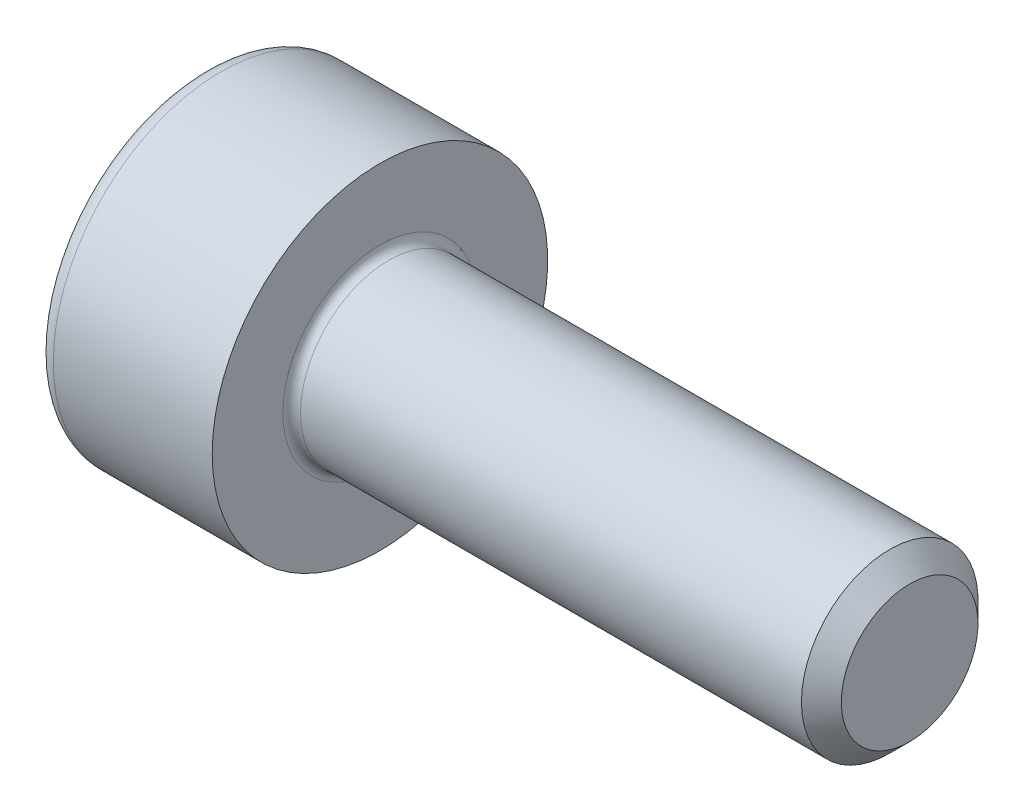
ISO-10303-21;
HEADER;
FILE_DESCRIPTION(('STEP AP214'),'2;1');
FILE_NAME('part.step','',(''),(''),'','','');
FILE_SCHEMA(('AUTOMOTIVE_DESIGN { 1 0 10303 214 1 1 1 1 }'));
ENDSEC;
DATA;
#1=APPLICATION_CONTEXT('core data for automotive mechanical design processes');
#2=APPLICATION_PROTOCOL_DEFINITION('international standard','automotive_design',2000,#1);
#3=PRODUCT_CONTEXT('',#1,'mechanical');
#4=PRODUCT('Part','Part','',(#3));
#5=PRODUCT_RELATED_PRODUCT_CATEGORY('part','',(#4));
#6=PRODUCT_DEFINITION_FORMATION('','',#4);
#7=PRODUCT_DEFINITION_CONTEXT('part definition',#1,'design');
#8=PRODUCT_DEFINITION('design','',#6,#7);
#9=PRODUCT_DEFINITION_SHAPE('','',#8);
#10=(LENGTH_UNIT() NAMED_UNIT(*) SI_UNIT(.MILLI.,.METRE.));
#11=(NAMED_UNIT(*) PLANE_ANGLE_UNIT() SI_UNIT($,.RADIAN.));
#12=(NAMED_UNIT(*) SI_UNIT($,.STERADIAN.) SOLID_ANGLE_UNIT());
#13=UNCERTAINTY_MEASURE_WITH_UNIT(LENGTH_MEASURE(1.E-05),#10,'distance_accuracy_value','');
#14=(GEOMETRIC_REPRESENTATION_CONTEXT(3) GLOBAL_UNCERTAINTY_ASSIGNED_CONTEXT((#13)) GLOBAL_UNIT_ASSIGNED_CONTEXT((#10,
#11,#12)) REPRESENTATION_CONTEXT('',''));
#15=CARTESIAN_POINT('',(0.,0.,0.));
#16=DIRECTION('',(0.,0.,1.));
#17=DIRECTION('',(1.,0.,0.));
#18=AXIS2_PLACEMENT_3D('',#15,#16,#17);
#19=CARTESIAN_POINT('',(0.999999999976353,0.,0.));
#20=DIRECTION('',(-1.,0.,0.));
#21=DIRECTION('',(0.,0.,1.));
#22=AXIS2_PLACEMENT_3D('',#19,#20,#21);
#23=CONICAL_SURFACE('',#22,0.760000000013861,1.04719755119142);
#24=CARTESIAN_POINT('',(1.43878620457372,0.,0.));
#25=VERTEX_POINT('',#24);
#26=VERTEX_LOOP('',#25);
#27=FACE_BOUND('',#26,.T.);
#28=CARTESIAN_POINT('',(0.999999999976353,0.,0.));
#29=DIRECTION('',(-1.,0.,0.));
#30=DIRECTION('',(0.,0.,1.));
#31=AXIS2_PLACEMENT_3D('',#28,#29,#30);
#32=CIRCLE('',#31,0.760000000013861);
#33=CARTESIAN_POINT('',(0.999999999988177,-0.658179306882178,0.380000000003467));
#34=VERTEX_POINT('',#33);
#35=CARTESIAN_POINT('',(0.999999999988177,0.,0.760000000006931));
#36=VERTEX_POINT('',#35);
#37=EDGE_CURVE('E101',#34,#36,#32,.T.);
#38=ORIENTED_EDGE('',*,*,#37,.T.);
#39=CARTESIAN_POINT('',(0.999999999976353,0.,0.));
#40=DIRECTION('',(-1.,0.,0.));
#41=DIRECTION('',(0.,0.,1.));
#42=AXIS2_PLACEMENT_3D('',#39,#40,#41);
#43=CIRCLE('',#42,0.760000000013861);
#44=CARTESIAN_POINT('',(0.999999999988177,0.658179306882173,0.380000000003464));
#45=VERTEX_POINT('',#44);
#46=EDGE_CURVE('E104',#36,#45,#43,.T.);
#47=ORIENTED_EDGE('',*,*,#46,.T.);
#48=CARTESIAN_POINT('',(0.999999999976353,0.,0.));
#49=DIRECTION('',(-1.,0.,0.));
#50=DIRECTION('',(0.,0.,1.));
#51=AXIS2_PLACEMENT_3D('',#48,#49,#50);
#52=CIRCLE('',#51,0.760000000013861);
#53=CARTESIAN_POINT('',(0.999999999988177,0.658179306882173,-0.380000000003465));
#54=VERTEX_POINT('',#53);
#55=EDGE_CURVE('E106',#45,#54,#52,.T.);
#56=ORIENTED_EDGE('',*,*,#55,.T.);
#57=CARTESIAN_POINT('',(0.999999999976353,0.,0.));
#58=DIRECTION('',(-1.,0.,0.));
#59=DIRECTION('',(0.,0.,1.));
#60=AXIS2_PLACEMENT_3D('',#57,#58,#59);
#61=CIRCLE('',#60,0.760000000013861);
#62=CARTESIAN_POINT('',(0.999999999988177,2.50381150740489E-13,-0.76000000000693));
#63=VERTEX_POINT('',#62);
#64=EDGE_CURVE('E120',#54,#63,#61,.T.);
#65=ORIENTED_EDGE('',*,*,#64,.T.);
#66=CARTESIAN_POINT('',(0.999999999976353,0.,0.));
#67=DIRECTION('',(-1.,0.,0.));
#68=DIRECTION('',(0.,0.,1.));
#69=AXIS2_PLACEMENT_3D('',#66,#67,#68);
#70=CIRCLE('',#69,0.760000000013861);
#71=CARTESIAN_POINT('',(0.999999999988177,-0.658179306882177,-0.380000000003467));
#72=VERTEX_POINT('',#71);
#73=EDGE_CURVE('E121',#63,#72,#70,.T.);
#74=ORIENTED_EDGE('',*,*,#73,.T.);
#75=CARTESIAN_POINT('',(0.999999999976353,0.,0.));
#76=DIRECTION('',(-1.,0.,0.));
#77=DIRECTION('',(0.,0.,1.));
#78=AXIS2_PLACEMENT_3D('',#75,#76,#77);
#79=CIRCLE('',#78,0.760000000013861);
#80=EDGE_CURVE('E229',#72,#34,#79,.T.);
#81=ORIENTED_EDGE('',*,*,#80,.T.);
#82=EDGE_LOOP('',(#38,#47,#56,#65,#74,#81));
#83=FACE_BOUND('',#82,.T.);
#84=ADVANCED_FACE('F16',(#27,#83),#23,.F.);
#85=CARTESIAN_POINT('',(1.,0.877572409168227,0.));
#86=DIRECTION('',(1.,0.,0.));
#87=DIRECTION('',(0.,0.,-1.));
#88=AXIS2_PLACEMENT_3D('',#85,#86,#87);
#89=PLANE('',#88);
#90=DIRECTION('',(0.,0.5,-0.866025403784438));
#91=VECTOR('',#90,1.);
#92=CARTESIAN_POINT('',(1.,0.877572409168227,0.));
#93=LINE('',#92,#91);
#94=CARTESIAN_POINT('',(1.,0.43878620458411,0.760000000000001));
#95=VERTEX_POINT('',#94);
#96=EDGE_CURVE('E124',#45,#95,#93,.F.);
#97=ORIENTED_EDGE('',*,*,#96,.F.);
#98=ORIENTED_EDGE('',*,*,#46,.F.);
#99=DIRECTION('',(0.,-1.,0.));
#100=VECTOR('',#99,1.);
#101=CARTESIAN_POINT('',(1.,-0.438786204584121,0.760000000000002));
#102=LINE('',#101,#100);
#103=EDGE_CURVE('E126',#36,#95,#102,.F.);
#104=ORIENTED_EDGE('',*,*,#103,.T.);
#105=EDGE_LOOP('',(#97,#98,#104));
#106=FACE_BOUND('',#105,.T.);
#107=ADVANCED_FACE('F125',(#106),#89,.F.);
#108=CARTESIAN_POINT('',(1.,0.877572409168227,0.));
#109=DIRECTION('',(1.,0.,0.));
#110=DIRECTION('',(0.,0.,-1.));
#111=AXIS2_PLACEMENT_3D('',#108,#109,#110);
#112=PLANE('',#111);
#113=DIRECTION('',(0.,-1.,0.));
#114=VECTOR('',#113,1.);
#115=CARTESIAN_POINT('',(1.,-0.438786204584121,0.760000000000002));
#116=LINE('',#115,#114);
#117=CARTESIAN_POINT('',(1.,-0.438786204584121,0.760000000000002));
#118=VERTEX_POINT('',#117);
#119=EDGE_CURVE('E129',#118,#36,#116,.F.);
#120=ORIENTED_EDGE('',*,*,#119,.T.);
#121=ORIENTED_EDGE('',*,*,#37,.F.);
#122=DIRECTION('',(0.,0.500000000000001,0.866025403784438));
#123=VECTOR('',#122,1.);
#124=CARTESIAN_POINT('',(1.,-0.438786204584121,0.760000000000002));
#125=LINE('',#124,#123);
#126=EDGE_CURVE('E182',#118,#34,#125,.F.);
#127=ORIENTED_EDGE('',*,*,#126,.F.);
#128=EDGE_LOOP('',(#120,#121,#127));
#129=FACE_BOUND('',#128,.T.);
#130=ADVANCED_FACE('F514',(#129),#112,.F.);
#131=CARTESIAN_POINT('',(1.,0.877572409168227,0.));
#132=DIRECTION('',(1.,0.,0.));
#133=DIRECTION('',(0.,0.,-1.));
#134=AXIS2_PLACEMENT_3D('',#131,#132,#133);
#135=PLANE('',#134);
#136=DIRECTION('',(0.,0.500000000000001,0.866025403784438));
#137=VECTOR('',#136,1.);
#138=CARTESIAN_POINT('',(1.,-0.438786204584121,0.760000000000002));
#139=LINE('',#138,#137);
#140=CARTESIAN_POINT('',(1.,-0.877572409168238,0.));
#141=VERTEX_POINT('',#140);
#142=EDGE_CURVE('E178',#34,#141,#139,.F.);
#143=ORIENTED_EDGE('',*,*,#142,.F.);
#144=ORIENTED_EDGE('',*,*,#80,.F.);
#145=DIRECTION('',(0.,-0.5,0.866025403784439));
#146=VECTOR('',#145,1.);
#147=CARTESIAN_POINT('',(1.,-0.877572409168238,0.));
#148=LINE('',#147,#146);
#149=EDGE_CURVE('E165',#141,#72,#148,.F.);
#150=ORIENTED_EDGE('',*,*,#149,.F.);
#151=EDGE_LOOP('',(#143,#144,#150));
#152=FACE_BOUND('',#151,.T.);
#153=ADVANCED_FACE('F505',(#152),#135,.F.);
#154=CARTESIAN_POINT('',(1.,0.877572409168227,0.));
#155=DIRECTION('',(1.,0.,0.));
#156=DIRECTION('',(0.,0.,-1.));
#157=AXIS2_PLACEMENT_3D('',#154,#155,#156);
#158=PLANE('',#157);
#159=DIRECTION('',(0.,-0.5,0.866025403784439));
#160=VECTOR('',#159,1.);
#161=CARTESIAN_POINT('',(1.,-0.877572409168238,0.));
#162=LINE('',#161,#160);
#163=CARTESIAN_POINT('',(1.,-0.438786204584122,-0.759999999999999));
#164=VERTEX_POINT('',#163);
#165=EDGE_CURVE('E162',#72,#164,#162,.F.);
#166=ORIENTED_EDGE('',*,*,#165,.F.);
#167=ORIENTED_EDGE('',*,*,#73,.F.);
#168=DIRECTION('',(0.,1.,0.));
#169=VECTOR('',#168,1.);
#170=CARTESIAN_POINT('',(1.,0.438786204584109,-0.76));
#171=LINE('',#170,#169);
#172=EDGE_CURVE('E156',#63,#164,#171,.F.);
#173=ORIENTED_EDGE('',*,*,#172,.T.);
#174=EDGE_LOOP('',(#166,#167,#173));
#175=FACE_BOUND('',#174,.T.);
#176=ADVANCED_FACE('F497',(#175),#158,.F.);
#177=CARTESIAN_POINT('',(1.,0.877572409168227,0.));
#178=DIRECTION('',(1.,0.,0.));
#179=DIRECTION('',(0.,0.,-1.));
#180=AXIS2_PLACEMENT_3D('',#177,#178,#179);
#181=PLANE('',#180);
#182=DIRECTION('',(0.,0.500000000000001,0.866025403784438));
#183=VECTOR('',#182,1.);
#184=CARTESIAN_POINT('',(1.,0.877572409168227,0.));
#185=LINE('',#184,#183);
#186=CARTESIAN_POINT('',(1.,0.877572409168227,0.));
#187=VERTEX_POINT('',#186);
#188=EDGE_CURVE('E118',#187,#54,#185,.F.);
#189=ORIENTED_EDGE('',*,*,#188,.T.);
#190=ORIENTED_EDGE('',*,*,#55,.F.);
#191=DIRECTION('',(0.,0.5,-0.866025403784438));
#192=VECTOR('',#191,1.);
#193=CARTESIAN_POINT('',(1.,0.877572409168227,0.));
#194=LINE('',#193,#192);
#195=EDGE_CURVE('E115',#187,#45,#194,.F.);
#196=ORIENTED_EDGE('',*,*,#195,.F.);
#197=EDGE_LOOP('',(#189,#190,#196));
#198=FACE_BOUND('',#197,.T.);
#199=ADVANCED_FACE('F113',(#198),#181,.F.);
#200=CARTESIAN_POINT('',(1.,0.877572409168227,0.));
#201=DIRECTION('',(1.,0.,0.));
#202=DIRECTION('',(0.,0.,-1.));
#203=AXIS2_PLACEMENT_3D('',#200,#201,#202);
#204=PLANE('',#203);
#205=DIRECTION('',(0.,1.,0.));
#206=VECTOR('',#205,1.);
#207=CARTESIAN_POINT('',(1.,0.438786204584109,-0.76));
#208=LINE('',#207,#206);
#209=CARTESIAN_POINT('',(1.,0.438786204584109,-0.76));
#210=VERTEX_POINT('',#209);
#211=EDGE_CURVE('E159',#210,#63,#208,.F.);
#212=ORIENTED_EDGE('',*,*,#211,.T.);
#213=ORIENTED_EDGE('',*,*,#64,.F.);
#214=DIRECTION('',(0.,0.500000000000001,0.866025403784438));
#215=VECTOR('',#214,1.);
#216=CARTESIAN_POINT('',(1.,0.877572409168227,0.));
#217=LINE('',#216,#215);
#218=EDGE_CURVE('E316',#54,#210,#217,.F.);
#219=ORIENTED_EDGE('',*,*,#218,.T.);
#220=EDGE_LOOP('',(#212,#213,#219));
#221=FACE_BOUND('',#220,.T.);
#222=ADVANCED_FACE('F481',(#221),#204,.F.);
#223=CARTESIAN_POINT('',(1.,0.877572409168227,0.));
#224=DIRECTION('',(0.,-0.866025403784438,-0.5));
#225=DIRECTION('',(0.,0.5,-0.866025403784438));
#226=AXIS2_PLACEMENT_3D('',#223,#224,#225);
#227=PLANE('',#226);
#228=ORIENTED_EDGE('',*,*,#96,.T.);
#229=DIRECTION('',(1.,0.,0.));
#230=VECTOR('',#229,1.);
#231=CARTESIAN_POINT('',(1.,0.43878620458411,0.76));
#232=LINE('',#231,#230);
#233=CARTESIAN_POINT('',(0.,0.43878620458411,0.76));
#234=VERTEX_POINT('',#233);
#235=EDGE_CURVE('E202',#95,#234,#232,.F.);
#236=ORIENTED_EDGE('',*,*,#235,.T.);
#237=DIRECTION('',(0.,-0.5,0.866025403784438));
#238=VECTOR('',#237,1.);
#239=CARTESIAN_POINT('',(0.,0.877572409168227,0.));
#240=LINE('',#239,#238);
#241=CARTESIAN_POINT('',(0.,0.877572409168227,0.));
#242=VERTEX_POINT('',#241);
#243=EDGE_CURVE('E142',#242,#234,#240,.T.);
#244=ORIENTED_EDGE('',*,*,#243,.F.);
#245=DIRECTION('',(1.,0.,0.));
#246=VECTOR('',#245,1.);
#247=CARTESIAN_POINT('',(1.,0.877572409168227,0.));
#248=LINE('',#247,#246);
#249=EDGE_CURVE('E133',#242,#187,#248,.T.);
#250=ORIENTED_EDGE('',*,*,#249,.T.);
#251=ORIENTED_EDGE('',*,*,#195,.T.);
#252=EDGE_LOOP('',(#228,#236,#244,#250,#251));
#253=FACE_BOUND('',#252,.T.);
#254=ADVANCED_FACE('F131',(#253),#227,.T.);
#255=CARTESIAN_POINT('',(1.,-0.438786204584121,0.760000000000002));
#256=DIRECTION('',(0.,0.,1.));
#257=DIRECTION('',(0.,-1.,0.));
#258=AXIS2_PLACEMENT_3D('',#255,#256,#257);
#259=PLANE('',#258);
#260=ORIENTED_EDGE('',*,*,#235,.F.);
#261=ORIENTED_EDGE('',*,*,#103,.F.);
#262=ORIENTED_EDGE('',*,*,#119,.F.);
#263=DIRECTION('',(1.,0.,0.));
#264=VECTOR('',#263,1.);
#265=CARTESIAN_POINT('',(1.,-0.438786204584121,0.760000000000002));
#266=LINE('',#265,#264);
#267=CARTESIAN_POINT('',(0.,-0.438786204584121,0.760000000000001));
#268=VERTEX_POINT('',#267);
#269=EDGE_CURVE('E197',#268,#118,#266,.T.);
#270=ORIENTED_EDGE('',*,*,#269,.F.);
#271=DIRECTION('',(0.,1.,0.));
#272=VECTOR('',#271,1.);
#273=CARTESIAN_POINT('',(0.,0.,0.76));
#274=LINE('',#273,#272);
#275=EDGE_CURVE('E145',#234,#268,#274,.F.);
#276=ORIENTED_EDGE('',*,*,#275,.F.);
#277=EDGE_LOOP('',(#260,#261,#262,#270,#276));
#278=FACE_BOUND('',#277,.T.);
#279=ADVANCED_FACE('F464',(#278),#259,.F.);
#280=CARTESIAN_POINT('',(1.,-0.438786204584121,0.760000000000002));
#281=DIRECTION('',(0.,0.866025403784438,-0.500000000000001));
#282=DIRECTION('',(0.,0.500000000000001,0.866025403784438));
#283=AXIS2_PLACEMENT_3D('',#280,#281,#282);
#284=PLANE('',#283);
#285=ORIENTED_EDGE('',*,*,#142,.T.);
#286=DIRECTION('',(1.,0.,0.));
#287=VECTOR('',#286,1.);
#288=CARTESIAN_POINT('',(1.,-0.877572409168238,0.));
#289=LINE('',#288,#287);
#290=CARTESIAN_POINT('',(0.,-0.877572409168238,0.));
#291=VERTEX_POINT('',#290);
#292=EDGE_CURVE('E173',#291,#141,#289,.T.);
#293=ORIENTED_EDGE('',*,*,#292,.F.);
#294=DIRECTION('',(0.,-0.500000000000001,-0.866025403784438));
#295=VECTOR('',#294,1.);
#296=CARTESIAN_POINT('',(0.,-0.438786204584121,0.760000000000002));
#297=LINE('',#296,#295);
#298=EDGE_CURVE('E188',#268,#291,#297,.T.);
#299=ORIENTED_EDGE('',*,*,#298,.F.);
#300=ORIENTED_EDGE('',*,*,#269,.T.);
#301=ORIENTED_EDGE('',*,*,#126,.T.);
#302=EDGE_LOOP('',(#285,#293,#299,#300,#301));
#303=FACE_BOUND('',#302,.T.);
#304=ADVANCED_FACE('F455',(#303),#284,.T.);
#305=CARTESIAN_POINT('',(1.,-0.877572409168238,0.));
#306=DIRECTION('',(0.,0.866025403784439,0.5));
#307=DIRECTION('',(0.,-0.5,0.866025403784439));
#308=AXIS2_PLACEMENT_3D('',#305,#306,#307);
#309=PLANE('',#308);
#310=ORIENTED_EDGE('',*,*,#165,.T.);
#311=DIRECTION('',(1.,0.,0.));
#312=VECTOR('',#311,1.);
#313=CARTESIAN_POINT('',(1.,-0.438786204584122,-0.759999999999999));
#314=LINE('',#313,#312);
#315=CARTESIAN_POINT('',(0.,-0.438786204584122,-0.759999999999999));
#316=VERTEX_POINT('',#315);
#317=EDGE_CURVE('E158',#164,#316,#314,.F.);
#318=ORIENTED_EDGE('',*,*,#317,.T.);
#319=DIRECTION('',(0.,0.5,-0.866025403784439));
#320=VECTOR('',#319,1.);
#321=CARTESIAN_POINT('',(0.,-0.877572409168238,0.));
#322=LINE('',#321,#320);
#323=EDGE_CURVE('E185',#291,#316,#322,.T.);
#324=ORIENTED_EDGE('',*,*,#323,.F.);
#325=ORIENTED_EDGE('',*,*,#292,.T.);
#326=ORIENTED_EDGE('',*,*,#149,.T.);
#327=EDGE_LOOP('',(#310,#318,#324,#325,#326));
#328=FACE_BOUND('',#327,.T.);
#329=ADVANCED_FACE('F447',(#328),#309,.T.);
#330=CARTESIAN_POINT('',(1.,0.438786204584109,-0.76));
#331=DIRECTION('',(0.,0.,-1.));
#332=DIRECTION('',(0.,1.,0.));
#333=AXIS2_PLACEMENT_3D('',#330,#331,#332);
#334=PLANE('',#333);
#335=ORIENTED_EDGE('',*,*,#317,.F.);
#336=ORIENTED_EDGE('',*,*,#172,.F.);
#337=ORIENTED_EDGE('',*,*,#211,.F.);
#338=DIRECTION('',(1.,0.,0.));
#339=VECTOR('',#338,1.);
#340=CARTESIAN_POINT('',(1.,0.438786204584109,-0.76));
#341=LINE('',#340,#339);
#342=CARTESIAN_POINT('',(0.,0.43878620458411,-0.76));
#343=VERTEX_POINT('',#342);
#344=EDGE_CURVE('E146',#210,#343,#341,.F.);
#345=ORIENTED_EDGE('',*,*,#344,.T.);
#346=DIRECTION('',(0.,1.,0.));
#347=VECTOR('',#346,1.);
#348=CARTESIAN_POINT('',(0.,0.,-0.759999999999999));
#349=LINE('',#348,#347);
#350=EDGE_CURVE('E153',#316,#343,#349,.T.);
#351=ORIENTED_EDGE('',*,*,#350,.F.);
#352=EDGE_LOOP('',(#335,#336,#337,#345,#351));
#353=FACE_BOUND('',#352,.T.);
#354=ADVANCED_FACE('F334',(#353),#334,.F.);
#355=CARTESIAN_POINT('',(1.,0.877572409168227,0.));
#356=DIRECTION('',(0.,0.866025403784438,-0.500000000000001));
#357=DIRECTION('',(0.,0.500000000000001,0.866025403784438));
#358=AXIS2_PLACEMENT_3D('',#355,#356,#357);
#359=PLANE('',#358);
#360=ORIENTED_EDGE('',*,*,#344,.F.);
#361=ORIENTED_EDGE('',*,*,#218,.F.);
#362=ORIENTED_EDGE('',*,*,#188,.F.);
#363=ORIENTED_EDGE('',*,*,#249,.F.);
#364=DIRECTION('',(0.,0.500000000000001,0.866025403784438));
#365=VECTOR('',#364,1.);
#366=CARTESIAN_POINT('',(0.,0.438786204584109,-0.76));
#367=LINE('',#366,#365);
#368=EDGE_CURVE('E149',#343,#242,#367,.T.);
#369=ORIENTED_EDGE('',*,*,#368,.F.);
#370=EDGE_LOOP('',(#360,#361,#362,#363,#369));
#371=FACE_BOUND('',#370,.T.);
#372=ADVANCED_FACE('F339',(#371),#359,.F.);
#373=CARTESIAN_POINT('',(0.,0.,0.));
#374=DIRECTION('',(-1.,0.,0.));
#375=DIRECTION('',(0.,0.,1.));
#376=AXIS2_PLACEMENT_3D('',#373,#374,#375);
#377=PLANE('',#376);
#378=CARTESIAN_POINT('',(0.,0.,0.));
#379=DIRECTION('',(1.,0.,0.));
#380=DIRECTION('',(0.,0.,-1.));
#381=AXIS2_PLACEMENT_3D('',#378,#379,#380);
#382=CIRCLE('',#381,1.7);
#383=CARTESIAN_POINT('',(0.,0.,-1.7));
#384=VERTEX_POINT('',#383);
#385=CARTESIAN_POINT('',(0.,0.,1.7));
#386=VERTEX_POINT('',#385);
#387=EDGE_CURVE('E152',#384,#386,#382,.T.);
#388=ORIENTED_EDGE('',*,*,#387,.F.);
#389=CARTESIAN_POINT('',(0.,0.,0.));
#390=DIRECTION('',(1.,0.,0.));
#391=DIRECTION('',(0.,0.,1.));
#392=AXIS2_PLACEMENT_3D('',#389,#390,#391);
#393=CIRCLE('',#392,1.7);
#394=EDGE_CURVE('E354',#386,#384,#393,.T.);
#395=ORIENTED_EDGE('',*,*,#394,.F.);
#396=EDGE_LOOP('',(#388,#395));
#397=FACE_BOUND('',#396,.T.);
#398=ORIENTED_EDGE('',*,*,#350,.T.);
#399=ORIENTED_EDGE('',*,*,#368,.T.);
#400=ORIENTED_EDGE('',*,*,#243,.T.);
#401=ORIENTED_EDGE('',*,*,#275,.T.);
#402=ORIENTED_EDGE('',*,*,#298,.T.);
#403=ORIENTED_EDGE('',*,*,#323,.T.);
#404=EDGE_LOOP('',(#398,#399,#400,#401,#402,#403));
#405=FACE_BOUND('',#404,.T.);
#406=ADVANCED_FACE('F298',(#397,#405),#377,.T.);
#407=CARTESIAN_POINT('',(0.199999999999999,0.,0.));
#408=DIRECTION('',(-1.,0.,0.));
#409=DIRECTION('',(0.,0.,1.));
#410=AXIS2_PLACEMENT_3D('',#407,#408,#409);
#411=TOROIDAL_SURFACE('',#410,1.7,0.2);
#412=CARTESIAN_POINT('',(0.199999999999999,0.,0.));
#413=DIRECTION('',(-1.,0.,0.));
#414=DIRECTION('',(0.,0.,1.));
#415=AXIS2_PLACEMENT_3D('',#412,#413,#414);
#416=CIRCLE('',#415,1.9);
#417=CARTESIAN_POINT('',(0.199999999999999,0.,1.9));
#418=VERTEX_POINT('',#417);
#419=EDGE_CURVE('E226',#418,#418,#416,.F.);
#420=ORIENTED_EDGE('',*,*,#419,.F.);
#421=EDGE_LOOP('',(#420));
#422=FACE_BOUND('',#421,.T.);
#423=ORIENTED_EDGE('',*,*,#394,.T.);
#424=ORIENTED_EDGE('',*,*,#387,.T.);
#425=EDGE_LOOP('',(#423,#424));
#426=FACE_BOUND('',#425,.T.);
#427=ADVANCED_FACE('F293',(#422,#426),#411,.T.);
#428=CARTESIAN_POINT('',(-31.75,0.,0.));
#429=DIRECTION('',(-1.,0.,0.));
#430=DIRECTION('',(0.,0.,1.));
#431=AXIS2_PLACEMENT_3D('',#428,#429,#430);
#432=CYLINDRICAL_SURFACE('',#431,1.9);
#433=CARTESIAN_POINT('',(2.,0.,0.));
#434=DIRECTION('',(-1.,0.,0.));
#435=DIRECTION('',(0.,0.,1.));
#436=AXIS2_PLACEMENT_3D('',#433,#434,#435);
#437=CIRCLE('',#436,1.9);
#438=CARTESIAN_POINT('',(2.,0.,1.9));
#439=VERTEX_POINT('',#438);
#440=EDGE_CURVE('E224',#439,#439,#437,.F.);
#441=ORIENTED_EDGE('',*,*,#440,.F.);
#442=EDGE_LOOP('',(#441));
#443=FACE_BOUND('',#442,.T.);
#444=ORIENTED_EDGE('',*,*,#419,.T.);
#445=EDGE_LOOP('',(#444));
#446=FACE_BOUND('',#445,.T.);
#447=ADVANCED_FACE('F297',(#443,#446),#432,.T.);
#448=CARTESIAN_POINT('',(8.,0.774,0.));
#449=DIRECTION('',(1.,0.,0.));
#450=DIRECTION('',(0.,0.,-1.));
#451=AXIS2_PLACEMENT_3D('',#448,#449,#450);
#452=PLANE('',#451);
#453=CARTESIAN_POINT('',(7.99999999998136,0.,0.));
#454=DIRECTION('',(-1.,0.,0.));
#455=DIRECTION('',(0.,0.,1.));
#456=AXIS2_PLACEMENT_3D('',#453,#454,#455);
#457=CIRCLE('',#456,0.773999999978514);
#458=CARTESIAN_POINT('',(7.99999999998136,0.,0.773999999978514));
#459=VERTEX_POINT('',#458);
#460=EDGE_CURVE('E220',#459,#459,#457,.T.);
#461=ORIENTED_EDGE('',*,*,#460,.F.);
#462=EDGE_LOOP('',(#461));
#463=FACE_BOUND('',#462,.T.);
#464=ADVANCED_FACE('F270',(#463),#452,.T.);
#465=CARTESIAN_POINT('',(2.,1.9,0.));
#466=DIRECTION('',(1.,0.,0.));
#467=DIRECTION('',(0.,0.,-1.));
#468=AXIS2_PLACEMENT_3D('',#465,#466,#467);
#469=PLANE('',#468);
#470=ORIENTED_EDGE('',*,*,#440,.T.);
#471=EDGE_LOOP('',(#470));
#472=FACE_BOUND('',#471,.T.);
#473=CARTESIAN_POINT('',(2.,0.,0.));
#474=DIRECTION('',(1.,0.,0.));
#475=DIRECTION('',(0.,0.,1.));
#476=AXIS2_PLACEMENT_3D('',#473,#474,#475);
#477=CIRCLE('',#476,1.1);
#478=CARTESIAN_POINT('',(2.,0.,-1.1));
#479=VERTEX_POINT('',#478);
#480=CARTESIAN_POINT('',(2.,0.,1.1));
#481=VERTEX_POINT('',#480);
#482=EDGE_CURVE('E223',#479,#481,#477,.F.);
#483=ORIENTED_EDGE('',*,*,#482,.T.);
#484=CARTESIAN_POINT('',(2.,0.,0.));
#485=DIRECTION('',(1.,0.,0.));
#486=DIRECTION('',(0.,0.,-1.));
#487=AXIS2_PLACEMENT_3D('',#484,#485,#486);
#488=CIRCLE('',#487,1.1);
#489=EDGE_CURVE('E35',#481,#479,#488,.F.);
#490=ORIENTED_EDGE('',*,*,#489,.T.);
#491=EDGE_LOOP('',(#483,#490));
#492=FACE_BOUND('',#491,.T.);
#493=ADVANCED_FACE('F261',(#472,#492),#469,.T.);
#494=CARTESIAN_POINT('',(7.77399999992667,0.,0.));
#495=DIRECTION('',(-1.,0.,0.));
#496=DIRECTION('',(0.,0.,1.));
#497=AXIS2_PLACEMENT_3D('',#494,#495,#496);
#498=CONICAL_SURFACE('',#497,0.999999999976353,0.785398163271689);
#499=CARTESIAN_POINT('',(7.774,0.,0.));
#500=DIRECTION('',(-1.,0.,0.));
#501=DIRECTION('',(0.,0.,1.));
#502=AXIS2_PLACEMENT_3D('',#499,#500,#501);
#503=CIRCLE('',#502,1.);
#504=CARTESIAN_POINT('',(7.774,0.,1.));
#505=VERTEX_POINT('',#504);
#506=EDGE_CURVE('E27',#505,#505,#503,.T.);
#507=ORIENTED_EDGE('',*,*,#506,.F.);
#508=EDGE_LOOP('',(#507));
#509=FACE_BOUND('',#508,.T.);
#510=ORIENTED_EDGE('',*,*,#460,.T.);
#511=EDGE_LOOP('',(#510));
#512=FACE_BOUND('',#511,.T.);
#513=ADVANCED_FACE('F249',(#509,#512),#498,.T.);
#514=CARTESIAN_POINT('',(2.1,0.,0.));
#515=DIRECTION('',(1.,0.,0.));
#516=DIRECTION('',(0.,0.,-1.));
#517=AXIS2_PLACEMENT_3D('',#514,#515,#516);
#518=TOROIDAL_SURFACE('',#517,1.1,0.1);
#519=CARTESIAN_POINT('',(2.1,0.,0.));
#520=DIRECTION('',(-1.,0.,0.));
#521=DIRECTION('',(0.,0.,1.));
#522=AXIS2_PLACEMENT_3D('',#519,#520,#521);
#523=CIRCLE('',#522,1.);
#524=CARTESIAN_POINT('',(2.1,0.,1.));
#525=VERTEX_POINT('',#524);
#526=EDGE_CURVE('E11',#525,#525,#523,.F.);
#527=ORIENTED_EDGE('',*,*,#526,.F.);
#528=EDGE_LOOP('',(#527));
#529=FACE_BOUND('',#528,.T.);
#530=ORIENTED_EDGE('',*,*,#482,.F.);
#531=ORIENTED_EDGE('',*,*,#489,.F.);
#532=EDGE_LOOP('',(#530,#531));
#533=FACE_BOUND('',#532,.T.);
#534=ADVANCED_FACE('F237',(#529,#533),#518,.F.);
#535=CARTESIAN_POINT('',(-31.75,0.,0.));
#536=DIRECTION('',(-1.,0.,0.));
#537=DIRECTION('',(0.,0.,1.));
#538=AXIS2_PLACEMENT_3D('',#535,#536,#537);
#539=CYLINDRICAL_SURFACE('',#538,1.);
#540=ORIENTED_EDGE('',*,*,#526,.T.);
#541=EDGE_LOOP('',(#540));
#542=FACE_BOUND('',#541,.T.);
#543=ORIENTED_EDGE('',*,*,#506,.T.);
#544=EDGE_LOOP('',(#543));
#545=FACE_BOUND('',#544,.T.);
#546=ADVANCED_FACE('F248',(#542,#545),#539,.T.);
#547=CLOSED_SHELL('',(#84,#107,#130,#153,#176,#199,#222,#254,#279,#304,#329,#354,#372,#406,#427,
#447,#464,#493,#513,#534,#546));
#548=MANIFOLD_SOLID_BREP('B1',#547);
#549=ADVANCED_BREP_SHAPE_REPRESENTATION('',(#18,#548),#14);
#550=SHAPE_DEFINITION_REPRESENTATION(#9,#549);
ENDSEC;
END-ISO-10303-21;
